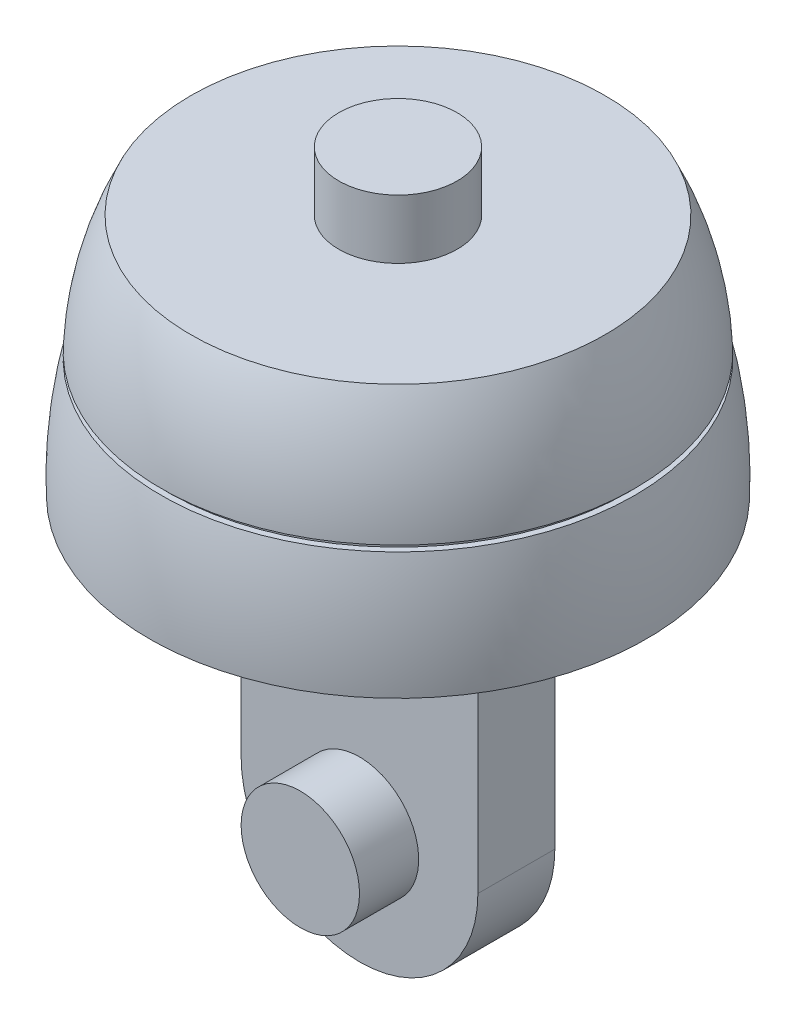
ISO-10303-21;
HEADER;
FILE_DESCRIPTION(('STEP AP214'),'2;1');
FILE_NAME('part.step','',(''),(''),'','','');
FILE_SCHEMA(('AUTOMOTIVE_DESIGN { 1 0 10303 214 1 1 1 1 }'));
ENDSEC;
DATA;
#1=APPLICATION_CONTEXT('core data for automotive mechanical design processes');
#2=APPLICATION_PROTOCOL_DEFINITION('international standard','automotive_design',2000,#1);
#3=PRODUCT_CONTEXT('',#1,'mechanical');
#4=PRODUCT('Part','Part','',(#3));
#5=PRODUCT_RELATED_PRODUCT_CATEGORY('part','',(#4));
#6=PRODUCT_DEFINITION_FORMATION('','',#4);
#7=PRODUCT_DEFINITION_CONTEXT('part definition',#1,'design');
#8=PRODUCT_DEFINITION('design','',#6,#7);
#9=PRODUCT_DEFINITION_SHAPE('','',#8);
#10=(LENGTH_UNIT() NAMED_UNIT(*) SI_UNIT(.MILLI.,.METRE.));
#11=(NAMED_UNIT(*) PLANE_ANGLE_UNIT() SI_UNIT($,.RADIAN.));
#12=(NAMED_UNIT(*) SI_UNIT($,.STERADIAN.) SOLID_ANGLE_UNIT());
#13=UNCERTAINTY_MEASURE_WITH_UNIT(LENGTH_MEASURE(1.E-05),#10,'distance_accuracy_value','');
#14=(GEOMETRIC_REPRESENTATION_CONTEXT(3) GLOBAL_UNCERTAINTY_ASSIGNED_CONTEXT((#13)) GLOBAL_UNIT_ASSIGNED_CONTEXT((#10,
#11,#12)) REPRESENTATION_CONTEXT('',''));
#15=CARTESIAN_POINT('',(0.,0.,0.));
#16=DIRECTION('',(0.,0.,1.));
#17=DIRECTION('',(1.,0.,0.));
#18=AXIS2_PLACEMENT_3D('',#15,#16,#17);
#19=CARTESIAN_POINT('',(0.,10.,0.));
#20=DIRECTION('',(0.,-1.,0.));
#21=DIRECTION('',(1.,0.,0.));
#22=AXIS2_PLACEMENT_3D('',#19,#20,#21);
#23=PLANE('',#22);
#24=CARTESIAN_POINT('',(0.,10.,0.));
#25=DIRECTION('',(0.,1.,0.));
#26=DIRECTION('',(-1.,0.,0.));
#27=AXIS2_PLACEMENT_3D('',#24,#25,#26);
#28=CIRCLE('',#27,5.);
#29=CARTESIAN_POINT('',(-5.,10.,0.));
#30=VERTEX_POINT('',#29);
#31=EDGE_CURVE('E11',#30,#30,#28,.T.);
#32=ORIENTED_EDGE('',*,*,#31,.F.);
#33=EDGE_LOOP('',(#32));
#34=FACE_BOUND('',#33,.T.);
#35=CARTESIAN_POINT('',(0.,10.,0.));
#36=DIRECTION('',(0.,1.,0.));
#37=DIRECTION('',(-1.,0.,0.));
#38=AXIS2_PLACEMENT_3D('',#35,#36,#37);
#39=CIRCLE('',#38,17.5);
#40=CARTESIAN_POINT('',(-17.5,10.,0.));
#41=VERTEX_POINT('',#40);
#42=EDGE_CURVE('E118',#41,#41,#39,.T.);
#43=ORIENTED_EDGE('',*,*,#42,.T.);
#44=EDGE_LOOP('',(#43));
#45=FACE_BOUND('',#44,.T.);
#46=ADVANCED_FACE('F17',(#34,#45),#23,.F.);
#47=CARTESIAN_POINT('',(0.,-0.933144687461524,0.));
#48=DIRECTION('',(0.,1.,0.));
#49=DIRECTION('',(-1.,0.,0.));
#50=AXIS2_PLACEMENT_3D('',#47,#48,#49);
#51=DEGENERATE_TOROIDAL_SURFACE('',#50,4.9825787498461,25.,.F.);
#52=ORIENTED_EDGE('',*,*,#42,.F.);
#53=EDGE_LOOP('',(#52));
#54=FACE_BOUND('',#53,.T.);
#55=CARTESIAN_POINT('',(0.,0.,0.));
#56=DIRECTION('',(0.,1.,0.));
#57=DIRECTION('',(-1.,0.,0.));
#58=AXIS2_PLACEMENT_3D('',#55,#56,#57);
#59=CIRCLE('',#58,20.);
#60=CARTESIAN_POINT('',(-20.,0.,0.));
#61=VERTEX_POINT('',#60);
#62=EDGE_CURVE('E115',#61,#61,#59,.T.);
#63=ORIENTED_EDGE('',*,*,#62,.T.);
#64=EDGE_LOOP('',(#63));
#65=FACE_BOUND('',#64,.T.);
#66=ADVANCED_FACE('F124',(#54,#65),#51,.F.);
#67=CARTESIAN_POINT('',(0.,0.,0.));
#68=DIRECTION('',(0.,1.,0.));
#69=DIRECTION('',(-1.,0.,0.));
#70=AXIS2_PLACEMENT_3D('',#67,#68,#69);
#71=PLANE('',#70);
#72=CARTESIAN_POINT('',(0.,0.,0.));
#73=DIRECTION('',(0.,-1.,0.));
#74=DIRECTION('',(1.,0.,0.));
#75=AXIS2_PLACEMENT_3D('',#72,#73,#74);
#76=CIRCLE('',#75,19.5);
#77=CARTESIAN_POINT('',(19.5,0.,0.));
#78=VERTEX_POINT('',#77);
#79=EDGE_CURVE('E106',#78,#78,#76,.T.);
#80=ORIENTED_EDGE('',*,*,#79,.F.);
#81=EDGE_LOOP('',(#80));
#82=FACE_BOUND('',#81,.T.);
#83=ORIENTED_EDGE('',*,*,#62,.F.);
#84=EDGE_LOOP('',(#83));
#85=FACE_BOUND('',#84,.T.);
#86=ADVANCED_FACE('F127',(#82,#85),#71,.F.);
#87=CARTESIAN_POINT('',(0.,-0.5,0.));
#88=DIRECTION('',(0.,1.,0.));
#89=DIRECTION('',(-1.,0.,0.));
#90=AXIS2_PLACEMENT_3D('',#87,#88,#89);
#91=CYLINDRICAL_SURFACE('',#90,19.5);
#92=CARTESIAN_POINT('',(0.,-0.5,0.));
#93=DIRECTION('',(0.,-1.,0.));
#94=DIRECTION('',(1.,0.,0.));
#95=AXIS2_PLACEMENT_3D('',#92,#93,#94);
#96=CIRCLE('',#95,19.5);
#97=CARTESIAN_POINT('',(19.5,-0.499999999999999,0.));
#98=VERTEX_POINT('',#97);
#99=EDGE_CURVE('E112',#98,#98,#96,.T.);
#100=ORIENTED_EDGE('',*,*,#99,.F.);
#101=EDGE_LOOP('',(#100));
#102=FACE_BOUND('',#101,.T.);
#103=ORIENTED_EDGE('',*,*,#79,.T.);
#104=EDGE_LOOP('',(#103));
#105=FACE_BOUND('',#104,.T.);
#106=ADVANCED_FACE('F131',(#102,#105),#91,.T.);
#107=CARTESIAN_POINT('',(0.,-0.500000000000001,0.));
#108=DIRECTION('',(0.,-1.,0.));
#109=DIRECTION('',(1.,0.,0.));
#110=AXIS2_PLACEMENT_3D('',#107,#108,#109);
#111=PLANE('',#110);
#112=ORIENTED_EDGE('',*,*,#99,.T.);
#113=EDGE_LOOP('',(#112));
#114=FACE_BOUND('',#113,.T.);
#115=CARTESIAN_POINT('',(0.,-0.500000000000002,0.));
#116=DIRECTION('',(0.,1.,0.));
#117=DIRECTION('',(-1.,0.,0.));
#118=AXIS2_PLACEMENT_3D('',#115,#116,#117);
#119=CIRCLE('',#118,20.);
#120=CARTESIAN_POINT('',(-20.,-0.500000000000005,0.));
#121=VERTEX_POINT('',#120);
#122=EDGE_CURVE('E109',#121,#121,#119,.T.);
#123=ORIENTED_EDGE('',*,*,#122,.T.);
#124=EDGE_LOOP('',(#123));
#125=FACE_BOUND('',#124,.T.);
#126=ADVANCED_FACE('F139',(#114,#125),#111,.F.);
#127=CARTESIAN_POINT('',(0.,-9.14752730566127,0.));
#128=DIRECTION('',(0.,1.,0.));
#129=DIRECTION('',(-1.,0.,0.));
#130=AXIS2_PLACEMENT_3D('',#127,#128,#129);
#131=DEGENERATE_TOROIDAL_SURFACE('',#130,15.9752730566127,37.,.F.);
#132=ORIENTED_EDGE('',*,*,#122,.F.);
#133=EDGE_LOOP('',(#132));
#134=FACE_BOUND('',#133,.T.);
#135=CARTESIAN_POINT('',(0.,-10.5,0.));
#136=DIRECTION('',(0.,1.,0.));
#137=DIRECTION('',(-1.,0.,0.));
#138=AXIS2_PLACEMENT_3D('',#135,#136,#137);
#139=CIRCLE('',#138,21.);
#140=CARTESIAN_POINT('',(-21.,-10.5,0.));
#141=VERTEX_POINT('',#140);
#142=EDGE_CURVE('E102',#141,#141,#139,.T.);
#143=ORIENTED_EDGE('',*,*,#142,.T.);
#144=EDGE_LOOP('',(#143));
#145=FACE_BOUND('',#144,.T.);
#146=ADVANCED_FACE('F196',(#134,#145),#131,.F.);
#147=CARTESIAN_POINT('',(0.,-10.5,0.));
#148=DIRECTION('',(0.,1.,0.));
#149=DIRECTION('',(-1.,0.,0.));
#150=AXIS2_PLACEMENT_3D('',#147,#148,#149);
#151=PLANE('',#150);
#152=CARTESIAN_POINT('',(0.,-10.5,0.));
#153=DIRECTION('',(0.,-1.,0.));
#154=DIRECTION('',(1.,0.,0.));
#155=AXIS2_PLACEMENT_3D('',#152,#153,#154);
#156=CIRCLE('',#155,17.5);
#157=CARTESIAN_POINT('',(17.5,-10.5,0.));
#158=VERTEX_POINT('',#157);
#159=EDGE_CURVE('E103',#158,#158,#156,.T.);
#160=ORIENTED_EDGE('',*,*,#159,.F.);
#161=EDGE_LOOP('',(#160));
#162=FACE_BOUND('',#161,.T.);
#163=ORIENTED_EDGE('',*,*,#142,.F.);
#164=EDGE_LOOP('',(#163));
#165=FACE_BOUND('',#164,.T.);
#166=ADVANCED_FACE('F192',(#162,#165),#151,.F.);
#167=CARTESIAN_POINT('',(0.,-12.,0.));
#168=DIRECTION('',(0.,1.,0.));
#169=DIRECTION('',(-1.,0.,0.));
#170=AXIS2_PLACEMENT_3D('',#167,#168,#169);
#171=CYLINDRICAL_SURFACE('',#170,17.5);
#172=CARTESIAN_POINT('',(0.,-12.,0.));
#173=DIRECTION('',(0.,-1.,0.));
#174=DIRECTION('',(1.,0.,0.));
#175=AXIS2_PLACEMENT_3D('',#172,#173,#174);
#176=CIRCLE('',#175,17.5);
#177=CARTESIAN_POINT('',(17.5,-12.,0.));
#178=VERTEX_POINT('',#177);
#179=EDGE_CURVE('E99',#178,#178,#176,.T.);
#180=ORIENTED_EDGE('',*,*,#179,.F.);
#181=EDGE_LOOP('',(#180));
#182=FACE_BOUND('',#181,.T.);
#183=ORIENTED_EDGE('',*,*,#159,.T.);
#184=EDGE_LOOP('',(#183));
#185=FACE_BOUND('',#184,.T.);
#186=ADVANCED_FACE('F189',(#182,#185),#171,.T.);
#187=CARTESIAN_POINT('',(0.,-12.,0.));
#188=DIRECTION('',(0.,-1.,0.));
#189=DIRECTION('',(1.,0.,0.));
#190=AXIS2_PLACEMENT_3D('',#187,#188,#189);
#191=PLANE('',#190);
#192=DIRECTION('',(0.,0.,-1.));
#193=VECTOR('',#192,1.);
#194=CARTESIAN_POINT('',(-10.,-12.,3.25));
#195=LINE('',#194,#193);
#196=CARTESIAN_POINT('',(-10.,-12.,3.25));
#197=VERTEX_POINT('',#196);
#198=CARTESIAN_POINT('',(-10.,-12.,-3.25));
#199=VERTEX_POINT('',#198);
#200=EDGE_CURVE('E32',#197,#199,#195,.T.);
#201=ORIENTED_EDGE('',*,*,#200,.F.);
#202=DIRECTION('',(-1.,0.,0.));
#203=VECTOR('',#202,1.);
#204=CARTESIAN_POINT('',(10.,-12.,3.25));
#205=LINE('',#204,#203);
#206=CARTESIAN_POINT('',(10.,-12.,3.25));
#207=VERTEX_POINT('',#206);
#208=EDGE_CURVE('E36',#207,#197,#205,.T.);
#209=ORIENTED_EDGE('',*,*,#208,.F.);
#210=DIRECTION('',(0.,0.,1.));
#211=VECTOR('',#210,1.);
#212=CARTESIAN_POINT('',(10.,-12.,3.25));
#213=LINE('',#212,#211);
#214=CARTESIAN_POINT('',(10.,-12.,-3.25));
#215=VERTEX_POINT('',#214);
#216=EDGE_CURVE('E91',#215,#207,#213,.T.);
#217=ORIENTED_EDGE('',*,*,#216,.F.);
#218=DIRECTION('',(1.,0.,0.));
#219=VECTOR('',#218,1.);
#220=CARTESIAN_POINT('',(10.,-12.,-3.25));
#221=LINE('',#220,#219);
#222=EDGE_CURVE('E88',#199,#215,#221,.T.);
#223=ORIENTED_EDGE('',*,*,#222,.F.);
#224=EDGE_LOOP('',(#201,#209,#217,#223));
#225=FACE_BOUND('',#224,.T.);
#226=ORIENTED_EDGE('',*,*,#179,.T.);
#227=EDGE_LOOP('',(#226));
#228=FACE_BOUND('',#227,.T.);
#229=ADVANCED_FACE('F186',(#225,#228),#191,.T.);
#230=CARTESIAN_POINT('',(-10.,-33.,3.25));
#231=DIRECTION('',(1.,0.,0.));
#232=DIRECTION('',(0.,0.,-1.));
#233=AXIS2_PLACEMENT_3D('',#230,#231,#232);
#234=PLANE('',#233);
#235=ORIENTED_EDGE('',*,*,#200,.T.);
#236=DIRECTION('',(0.,1.,0.));
#237=VECTOR('',#236,1.);
#238=CARTESIAN_POINT('',(-9.99999999999999,-33.,-3.25));
#239=LINE('',#238,#237);
#240=CARTESIAN_POINT('',(-9.99999999999999,-33.,-3.25));
#241=VERTEX_POINT('',#240);
#242=EDGE_CURVE('E61',#241,#199,#239,.T.);
#243=ORIENTED_EDGE('',*,*,#242,.F.);
#244=DIRECTION('',(0.,0.,-1.));
#245=VECTOR('',#244,1.);
#246=CARTESIAN_POINT('',(-10.,-33.,3.25));
#247=LINE('',#246,#245);
#248=CARTESIAN_POINT('',(-10.,-33.,3.25));
#249=VERTEX_POINT('',#248);
#250=EDGE_CURVE('E56',#249,#241,#247,.T.);
#251=ORIENTED_EDGE('',*,*,#250,.F.);
#252=DIRECTION('',(0.,1.,0.));
#253=VECTOR('',#252,1.);
#254=CARTESIAN_POINT('',(-10.,-33.,3.25));
#255=LINE('',#254,#253);
#256=EDGE_CURVE('E59',#249,#197,#255,.T.);
#257=ORIENTED_EDGE('',*,*,#256,.T.);
#258=EDGE_LOOP('',(#235,#243,#251,#257));
#259=FACE_BOUND('',#258,.T.);
#260=ADVANCED_FACE('F58',(#259),#234,.F.);
#261=CARTESIAN_POINT('',(10.,-33.,-3.25));
#262=DIRECTION('',(0.,0.,1.));
#263=DIRECTION('',(1.,0.,0.));
#264=AXIS2_PLACEMENT_3D('',#261,#262,#263);
#265=PLANE('',#264);
#266=ORIENTED_EDGE('',*,*,#222,.T.);
#267=DIRECTION('',(0.,1.,0.));
#268=VECTOR('',#267,1.);
#269=CARTESIAN_POINT('',(10.,-33.,-3.25));
#270=LINE('',#269,#268);
#271=CARTESIAN_POINT('',(10.,-33.,-3.25));
#272=VERTEX_POINT('',#271);
#273=EDGE_CURVE('E95',#272,#215,#270,.T.);
#274=ORIENTED_EDGE('',*,*,#273,.F.);
#275=CARTESIAN_POINT('',(0.,-33.,-3.25));
#276=DIRECTION('',(0.,0.,1.));
#277=DIRECTION('',(1.,0.,0.));
#278=AXIS2_PLACEMENT_3D('',#275,#276,#277);
#279=CIRCLE('',#278,10.);
#280=EDGE_CURVE('E78',#241,#272,#279,.T.);
#281=ORIENTED_EDGE('',*,*,#280,.F.);
#282=ORIENTED_EDGE('',*,*,#242,.T.);
#283=EDGE_LOOP('',(#266,#274,#281,#282));
#284=FACE_BOUND('',#283,.T.);
#285=ADVANCED_FACE('F179',(#284),#265,.F.);
#286=CARTESIAN_POINT('',(10.,-33.,3.25));
#287=DIRECTION('',(-1.,0.,0.));
#288=DIRECTION('',(0.,-1.,0.));
#289=AXIS2_PLACEMENT_3D('',#286,#287,#288);
#290=PLANE('',#289);
#291=ORIENTED_EDGE('',*,*,#216,.T.);
#292=DIRECTION('',(0.,1.,0.));
#293=VECTOR('',#292,1.);
#294=CARTESIAN_POINT('',(10.,-33.,3.25));
#295=LINE('',#294,#293);
#296=CARTESIAN_POINT('',(10.,-33.,3.25));
#297=VERTEX_POINT('',#296);
#298=EDGE_CURVE('E73',#297,#207,#295,.T.);
#299=ORIENTED_EDGE('',*,*,#298,.F.);
#300=DIRECTION('',(0.,0.,1.));
#301=VECTOR('',#300,1.);
#302=CARTESIAN_POINT('',(10.,-33.,3.25));
#303=LINE('',#302,#301);
#304=EDGE_CURVE('E66',#272,#297,#303,.T.);
#305=ORIENTED_EDGE('',*,*,#304,.F.);
#306=ORIENTED_EDGE('',*,*,#273,.T.);
#307=EDGE_LOOP('',(#291,#299,#305,#306));
#308=FACE_BOUND('',#307,.T.);
#309=ADVANCED_FACE('F175',(#308),#290,.F.);
#310=CARTESIAN_POINT('',(10.,-33.,3.25));
#311=DIRECTION('',(0.,0.,-1.));
#312=DIRECTION('',(-1.,0.,0.));
#313=AXIS2_PLACEMENT_3D('',#310,#311,#312);
#314=PLANE('',#313);
#315=CARTESIAN_POINT('',(0.,-33.,3.25));
#316=DIRECTION('',(0.,0.,-1.));
#317=DIRECTION('',(-1.,0.,0.));
#318=AXIS2_PLACEMENT_3D('',#315,#316,#317);
#319=CIRCLE('',#318,5.);
#320=CARTESIAN_POINT('',(-5.,-33.,3.25));
#321=VERTEX_POINT('',#320);
#322=EDGE_CURVE('E20',#321,#321,#319,.F.);
#323=ORIENTED_EDGE('',*,*,#322,.F.);
#324=EDGE_LOOP('',(#323));
#325=FACE_BOUND('',#324,.T.);
#326=ORIENTED_EDGE('',*,*,#208,.T.);
#327=ORIENTED_EDGE('',*,*,#256,.F.);
#328=CARTESIAN_POINT('',(0.,-33.,3.25));
#329=DIRECTION('',(0.,0.,1.));
#330=DIRECTION('',(1.,0.,0.));
#331=AXIS2_PLACEMENT_3D('',#328,#329,#330);
#332=CIRCLE('',#331,10.);
#333=EDGE_CURVE('E72',#249,#297,#332,.T.);
#334=ORIENTED_EDGE('',*,*,#333,.T.);
#335=ORIENTED_EDGE('',*,*,#298,.T.);
#336=EDGE_LOOP('',(#326,#327,#334,#335));
#337=FACE_BOUND('',#336,.T.);
#338=ADVANCED_FACE('F70',(#325,#337),#314,.F.);
#339=CARTESIAN_POINT('',(0.,-33.,-3.25));
#340=DIRECTION('',(0.,0.,1.));
#341=DIRECTION('',(1.,0.,0.));
#342=AXIS2_PLACEMENT_3D('',#339,#340,#341);
#343=CYLINDRICAL_SURFACE('',#342,10.);
#344=ORIENTED_EDGE('',*,*,#333,.F.);
#345=ORIENTED_EDGE('',*,*,#250,.T.);
#346=ORIENTED_EDGE('',*,*,#280,.T.);
#347=ORIENTED_EDGE('',*,*,#304,.T.);
#348=EDGE_LOOP('',(#344,#345,#346,#347));
#349=FACE_BOUND('',#348,.T.);
#350=ADVANCED_FACE('F76',(#349),#343,.T.);
#351=CARTESIAN_POINT('',(0.,-33.,8.25));
#352=DIRECTION('',(0.,0.,-1.));
#353=DIRECTION('',(-1.,0.,0.));
#354=AXIS2_PLACEMENT_3D('',#351,#352,#353);
#355=CYLINDRICAL_SURFACE('',#354,5.);
#356=CARTESIAN_POINT('',(0.,-33.,8.25));
#357=DIRECTION('',(0.,0.,1.));
#358=DIRECTION('',(1.,0.,0.));
#359=AXIS2_PLACEMENT_3D('',#356,#357,#358);
#360=CIRCLE('',#359,5.);
#361=CARTESIAN_POINT('',(5.,-33.,8.25));
#362=VERTEX_POINT('',#361);
#363=EDGE_CURVE('E79',#362,#362,#360,.T.);
#364=ORIENTED_EDGE('',*,*,#363,.F.);
#365=EDGE_LOOP('',(#364));
#366=FACE_BOUND('',#365,.T.);
#367=ORIENTED_EDGE('',*,*,#322,.T.);
#368=EDGE_LOOP('',(#367));
#369=FACE_BOUND('',#368,.T.);
#370=ADVANCED_FACE('F163',(#366,#369),#355,.T.);
#371=CARTESIAN_POINT('',(0.,-33.,8.25));
#372=DIRECTION('',(0.,0.,1.));
#373=DIRECTION('',(1.,0.,0.));
#374=AXIS2_PLACEMENT_3D('',#371,#372,#373);
#375=PLANE('',#374);
#376=ORIENTED_EDGE('',*,*,#363,.T.);
#377=EDGE_LOOP('',(#376));
#378=FACE_BOUND('',#377,.T.);
#379=ADVANCED_FACE('F153',(#378),#375,.T.);
#380=CARTESIAN_POINT('',(0.,15.,0.));
#381=DIRECTION('',(0.,-1.,0.));
#382=DIRECTION('',(1.,0.,0.));
#383=AXIS2_PLACEMENT_3D('',#380,#381,#382);
#384=CYLINDRICAL_SURFACE('',#383,5.);
#385=CARTESIAN_POINT('',(0.,15.,0.));
#386=DIRECTION('',(0.,1.,0.));
#387=DIRECTION('',(-1.,0.,0.));
#388=AXIS2_PLACEMENT_3D('',#385,#386,#387);
#389=CIRCLE('',#388,5.);
#390=CARTESIAN_POINT('',(-5.,15.,0.));
#391=VERTEX_POINT('',#390);
#392=EDGE_CURVE('E83',#391,#391,#389,.T.);
#393=ORIENTED_EDGE('',*,*,#392,.F.);
#394=EDGE_LOOP('',(#393));
#395=FACE_BOUND('',#394,.T.);
#396=ORIENTED_EDGE('',*,*,#31,.T.);
#397=EDGE_LOOP('',(#396));
#398=FACE_BOUND('',#397,.T.);
#399=ADVANCED_FACE('F150',(#395,#398),#384,.T.);
#400=CARTESIAN_POINT('',(0.,15.,0.));
#401=DIRECTION('',(0.,1.,0.));
#402=DIRECTION('',(-1.,0.,0.));
#403=AXIS2_PLACEMENT_3D('',#400,#401,#402);
#404=PLANE('',#403);
#405=ORIENTED_EDGE('',*,*,#392,.T.);
#406=EDGE_LOOP('',(#405));
#407=FACE_BOUND('',#406,.T.);
#408=ADVANCED_FACE('F152',(#407),#404,.T.);
#409=CLOSED_SHELL('',(#46,#66,#86,#106,#126,#146,#166,#186,#229,#260,#285,#309,#338,#350,#370,
#379,#399,#408));
#410=MANIFOLD_SOLID_BREP('B1',#409);
#411=ADVANCED_BREP_SHAPE_REPRESENTATION('',(#18,#410),#14);
#412=SHAPE_DEFINITION_REPRESENTATION(#9,#411);
ENDSEC;
END-ISO-10303-21;
